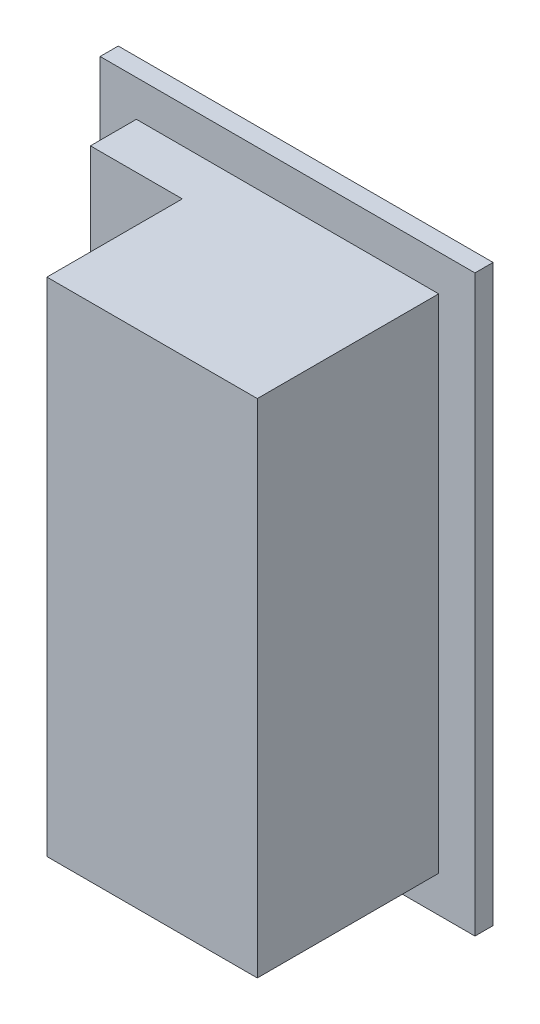
ISO-10303-21;
HEADER;
FILE_DESCRIPTION(('STEP AP214'),'2;1');
FILE_NAME('part.step','',(''),(''),'','','');
FILE_SCHEMA(('AUTOMOTIVE_DESIGN { 1 0 10303 214 1 1 1 1 }'));
ENDSEC;
DATA;
#1=APPLICATION_CONTEXT('core data for automotive mechanical design processes');
#2=APPLICATION_PROTOCOL_DEFINITION('international standard','automotive_design',2000,#1);
#3=PRODUCT_CONTEXT('',#1,'mechanical');
#4=PRODUCT('Part','Part','',(#3));
#5=PRODUCT_RELATED_PRODUCT_CATEGORY('part','',(#4));
#6=PRODUCT_DEFINITION_FORMATION('','',#4);
#7=PRODUCT_DEFINITION_CONTEXT('part definition',#1,'design');
#8=PRODUCT_DEFINITION('design','',#6,#7);
#9=PRODUCT_DEFINITION_SHAPE('','',#8);
#10=(LENGTH_UNIT() NAMED_UNIT(*) SI_UNIT(.MILLI.,.METRE.));
#11=(NAMED_UNIT(*) PLANE_ANGLE_UNIT() SI_UNIT($,.RADIAN.));
#12=(NAMED_UNIT(*) SI_UNIT($,.STERADIAN.) SOLID_ANGLE_UNIT());
#13=UNCERTAINTY_MEASURE_WITH_UNIT(LENGTH_MEASURE(1.E-05),#10,'distance_accuracy_value','');
#14=(GEOMETRIC_REPRESENTATION_CONTEXT(3) GLOBAL_UNCERTAINTY_ASSIGNED_CONTEXT((#13)) GLOBAL_UNIT_ASSIGNED_CONTEXT((#10,
#11,#12)) REPRESENTATION_CONTEXT('',''));
#15=CARTESIAN_POINT('',(0.,0.,0.));
#16=DIRECTION('',(0.,0.,1.));
#17=DIRECTION('',(1.,0.,0.));
#18=AXIS2_PLACEMENT_3D('',#15,#16,#17);
#19=CARTESIAN_POINT('',(0.,0.,1.5));
#20=DIRECTION('',(0.,0.,1.));
#21=DIRECTION('',(1.,0.,0.));
#22=AXIS2_PLACEMENT_3D('',#19,#20,#21);
#23=PLANE('',#22);
#24=DIRECTION('',(1.,0.,0.));
#25=VECTOR('',#24,1.);
#26=CARTESIAN_POINT('',(0.,0.,1.5));
#27=LINE('',#26,#25);
#28=CARTESIAN_POINT('',(-1.,0.,1.5));
#29=VERTEX_POINT('',#28);
#30=CARTESIAN_POINT('',(24.,0.,1.5));
#31=VERTEX_POINT('',#30);
#32=EDGE_CURVE('E256',#29,#31,#27,.T.);
#33=ORIENTED_EDGE('',*,*,#32,.F.);
#34=DIRECTION('',(0.,-1.,0.));
#35=VECTOR('',#34,1.);
#36=CARTESIAN_POINT('',(-1.,41.5,1.5));
#37=LINE('',#36,#35);
#38=CARTESIAN_POINT('',(-1.,41.5,1.5));
#39=VERTEX_POINT('',#38);
#40=EDGE_CURVE('E50',#39,#29,#37,.T.);
#41=ORIENTED_EDGE('',*,*,#40,.F.);
#42=DIRECTION('',(1.,0.,0.));
#43=VECTOR('',#42,1.);
#44=CARTESIAN_POINT('',(0.,41.5,1.5));
#45=LINE('',#44,#43);
#46=CARTESIAN_POINT('',(24.,41.5,1.5));
#47=VERTEX_POINT('',#46);
#48=EDGE_CURVE('E259',#39,#47,#45,.T.);
#49=ORIENTED_EDGE('',*,*,#48,.T.);
#50=DIRECTION('',(0.,1.,0.));
#51=VECTOR('',#50,1.);
#52=CARTESIAN_POINT('',(24.,0.,1.5));
#53=LINE('',#52,#51);
#54=EDGE_CURVE('E253',#31,#47,#53,.T.);
#55=ORIENTED_EDGE('',*,*,#54,.F.);
#56=EDGE_LOOP('',(#33,#41,#49,#55));
#57=FACE_BOUND('',#56,.T.);
#58=DIRECTION('',(1.,0.,0.));
#59=VECTOR('',#58,1.);
#60=CARTESIAN_POINT('',(0.,-3.,1.5));
#61=LINE('',#60,#59);
#62=CARTESIAN_POINT('',(-4.,-3.,1.5));
#63=VERTEX_POINT('',#62);
#64=CARTESIAN_POINT('',(27.,-3.,1.5));
#65=VERTEX_POINT('',#64);
#66=EDGE_CURVE('E261',#63,#65,#61,.T.);
#67=ORIENTED_EDGE('',*,*,#66,.T.);
#68=DIRECTION('',(0.,1.,0.));
#69=VECTOR('',#68,1.);
#70=CARTESIAN_POINT('',(27.,0.,1.5));
#71=LINE('',#70,#69);
#72=CARTESIAN_POINT('',(27.,44.5,1.5));
#73=VERTEX_POINT('',#72);
#74=EDGE_CURVE('E264',#65,#73,#71,.T.);
#75=ORIENTED_EDGE('',*,*,#74,.T.);
#76=DIRECTION('',(1.,0.,0.));
#77=VECTOR('',#76,1.);
#78=CARTESIAN_POINT('',(0.,44.5,1.5));
#79=LINE('',#78,#77);
#80=CARTESIAN_POINT('',(-4.,44.5,1.5));
#81=VERTEX_POINT('',#80);
#82=EDGE_CURVE('E266',#81,#73,#79,.T.);
#83=ORIENTED_EDGE('',*,*,#82,.F.);
#84=DIRECTION('',(0.,1.,0.));
#85=VECTOR('',#84,1.);
#86=CARTESIAN_POINT('',(-4.,0.,1.5));
#87=LINE('',#86,#85);
#88=EDGE_CURVE('E269',#63,#81,#87,.T.);
#89=ORIENTED_EDGE('',*,*,#88,.F.);
#90=EDGE_LOOP('',(#67,#75,#83,#89));
#91=FACE_BOUND('',#90,.T.);
#92=ADVANCED_FACE('F35',(#57,#91),#23,.T.);
#93=CARTESIAN_POINT('',(6.6,0.,-40.521542094502));
#94=DIRECTION('',(1.,0.,0.));
#95=DIRECTION('',(0.,0.,-1.));
#96=AXIS2_PLACEMENT_3D('',#93,#94,#95);
#97=PLANE('',#96);
#98=DIRECTION('',(0.,1.,0.));
#99=VECTOR('',#98,1.);
#100=CARTESIAN_POINT('',(6.6,0.,5.3));
#101=LINE('',#100,#99);
#102=CARTESIAN_POINT('',(6.6,0.,5.3));
#103=VERTEX_POINT('',#102);
#104=CARTESIAN_POINT('',(6.6,0.999999999999998,5.3));
#105=VERTEX_POINT('',#104);
#106=EDGE_CURVE('E189',#103,#105,#101,.T.);
#107=ORIENTED_EDGE('',*,*,#106,.F.);
#108=DIRECTION('',(0.,0.,1.));
#109=VECTOR('',#108,1.);
#110=CARTESIAN_POINT('',(6.6,0.,-40.521542094502));
#111=LINE('',#110,#109);
#112=CARTESIAN_POINT('',(6.6,0.,16.5));
#113=VERTEX_POINT('',#112);
#114=EDGE_CURVE('E208',#103,#113,#111,.T.);
#115=ORIENTED_EDGE('',*,*,#114,.T.);
#116=DIRECTION('',(0.,1.,0.));
#117=VECTOR('',#116,1.);
#118=CARTESIAN_POINT('',(6.6,0.,16.5));
#119=LINE('',#118,#117);
#120=CARTESIAN_POINT('',(6.6,41.5,16.5));
#121=VERTEX_POINT('',#120);
#122=EDGE_CURVE('E201',#113,#121,#119,.T.);
#123=ORIENTED_EDGE('',*,*,#122,.T.);
#124=DIRECTION('',(0.,0.,1.));
#125=VECTOR('',#124,1.);
#126=CARTESIAN_POINT('',(6.6,41.5,-40.521542094502));
#127=LINE('',#126,#125);
#128=CARTESIAN_POINT('',(6.6,41.5,5.29999999999999));
#129=VERTEX_POINT('',#128);
#130=EDGE_CURVE('E209',#129,#121,#127,.T.);
#131=ORIENTED_EDGE('',*,*,#130,.F.);
#132=DIRECTION('',(0.,1.,0.));
#133=VECTOR('',#132,1.);
#134=CARTESIAN_POINT('',(6.6,41.5,5.3));
#135=LINE('',#134,#133);
#136=CARTESIAN_POINT('',(6.6,40.5,5.3));
#137=VERTEX_POINT('',#136);
#138=EDGE_CURVE('E58',#137,#129,#135,.T.);
#139=ORIENTED_EDGE('',*,*,#138,.F.);
#140=DIRECTION('',(0.,0.,-1.));
#141=VECTOR('',#140,1.);
#142=CARTESIAN_POINT('',(6.6,40.5,16.5));
#143=LINE('',#142,#141);
#144=CARTESIAN_POINT('',(6.6,40.5,15.5));
#145=VERTEX_POINT('',#144);
#146=EDGE_CURVE('E180',#145,#137,#143,.T.);
#147=ORIENTED_EDGE('',*,*,#146,.F.);
#148=DIRECTION('',(0.,1.,0.));
#149=VECTOR('',#148,1.);
#150=CARTESIAN_POINT('',(6.6,0.,15.5));
#151=LINE('',#150,#149);
#152=CARTESIAN_POINT('',(6.6,0.999999999999997,15.5));
#153=VERTEX_POINT('',#152);
#154=EDGE_CURVE('E11',#153,#145,#151,.T.);
#155=ORIENTED_EDGE('',*,*,#154,.F.);
#156=DIRECTION('',(0.,0.,1.));
#157=VECTOR('',#156,1.);
#158=CARTESIAN_POINT('',(6.6,0.999999999999998,16.5));
#159=LINE('',#158,#157);
#160=EDGE_CURVE('E213',#105,#153,#159,.T.);
#161=ORIENTED_EDGE('',*,*,#160,.F.);
#162=EDGE_LOOP('',(#107,#115,#123,#131,#139,#147,#155,#161));
#163=FACE_BOUND('',#162,.T.);
#164=ADVANCED_FACE('F310',(#163),#97,.F.);
#165=CARTESIAN_POINT('',(23.,0.,16.5));
#166=DIRECTION('',(1.,0.,0.));
#167=DIRECTION('',(0.,1.,0.));
#168=AXIS2_PLACEMENT_3D('',#165,#166,#167);
#169=PLANE('',#168);
#170=DIRECTION('',(0.,1.,0.));
#171=VECTOR('',#170,1.);
#172=CARTESIAN_POINT('',(23.,0.,15.5));
#173=LINE('',#172,#171);
#174=CARTESIAN_POINT('',(23.,1.,15.5));
#175=VERTEX_POINT('',#174);
#176=CARTESIAN_POINT('',(23.,40.5,15.5));
#177=VERTEX_POINT('',#176);
#178=EDGE_CURVE('E217',#175,#177,#173,.T.);
#179=ORIENTED_EDGE('',*,*,#178,.T.);
#180=DIRECTION('',(0.,0.,-1.));
#181=VECTOR('',#180,1.);
#182=CARTESIAN_POINT('',(23.,40.5,16.5));
#183=LINE('',#182,#181);
#184=CARTESIAN_POINT('',(23.,40.5,0.));
#185=VERTEX_POINT('',#184);
#186=EDGE_CURVE('E231',#177,#185,#183,.T.);
#187=ORIENTED_EDGE('',*,*,#186,.T.);
#188=DIRECTION('',(0.,-1.,0.));
#189=VECTOR('',#188,1.);
#190=CARTESIAN_POINT('',(23.,0.,0.));
#191=LINE('',#190,#189);
#192=CARTESIAN_POINT('',(23.,1.,0.));
#193=VERTEX_POINT('',#192);
#194=EDGE_CURVE('E222',#185,#193,#191,.T.);
#195=ORIENTED_EDGE('',*,*,#194,.T.);
#196=DIRECTION('',(0.,0.,-1.));
#197=VECTOR('',#196,1.);
#198=CARTESIAN_POINT('',(23.,1.,16.5));
#199=LINE('',#198,#197);
#200=EDGE_CURVE('E250',#175,#193,#199,.T.);
#201=ORIENTED_EDGE('',*,*,#200,.F.);
#202=EDGE_LOOP('',(#179,#187,#195,#201));
#203=FACE_BOUND('',#202,.T.);
#204=ADVANCED_FACE('F316',(#203),#169,.F.);
#205=CARTESIAN_POINT('',(0.,0.999999999999997,16.5));
#206=DIRECTION('',(0.,-1.,0.));
#207=DIRECTION('',(1.,0.,0.));
#208=AXIS2_PLACEMENT_3D('',#205,#206,#207);
#209=PLANE('',#208);
#210=DIRECTION('',(0.,0.,-1.));
#211=VECTOR('',#210,1.);
#212=CARTESIAN_POINT('',(0.,0.999999999999999,16.5));
#213=LINE('',#212,#211);
#214=CARTESIAN_POINT('',(0.,0.999999999999997,4.3));
#215=VERTEX_POINT('',#214);
#216=CARTESIAN_POINT('',(0.,0.999999999999999,0.));
#217=VERTEX_POINT('',#216);
#218=EDGE_CURVE('E248',#215,#217,#213,.T.);
#219=ORIENTED_EDGE('',*,*,#218,.F.);
#220=DIRECTION('',(-1.,0.,0.));
#221=VECTOR('',#220,1.);
#222=CARTESIAN_POINT('',(0.,0.999999999999997,4.3));
#223=LINE('',#222,#221);
#224=CARTESIAN_POINT('',(6.6,0.999999999999997,4.3));
#225=VERTEX_POINT('',#224);
#226=EDGE_CURVE('E166',#225,#215,#223,.T.);
#227=ORIENTED_EDGE('',*,*,#226,.F.);
#228=DIRECTION('',(0.,0.,-1.));
#229=VECTOR('',#228,1.);
#230=CARTESIAN_POINT('',(6.6,0.999999999999997,16.5));
#231=LINE('',#230,#229);
#232=EDGE_CURVE('E162',#105,#225,#231,.T.);
#233=ORIENTED_EDGE('',*,*,#232,.F.);
#234=ORIENTED_EDGE('',*,*,#160,.T.);
#235=DIRECTION('',(1.,0.,0.));
#236=VECTOR('',#235,1.);
#237=CARTESIAN_POINT('',(0.,0.999999999999997,15.5));
#238=LINE('',#237,#236);
#239=EDGE_CURVE('E215',#153,#175,#238,.T.);
#240=ORIENTED_EDGE('',*,*,#239,.T.);
#241=ORIENTED_EDGE('',*,*,#200,.T.);
#242=DIRECTION('',(-1.,0.,0.));
#243=VECTOR('',#242,1.);
#244=CARTESIAN_POINT('',(0.,0.999999999999997,0.));
#245=LINE('',#244,#243);
#246=EDGE_CURVE('E234',#193,#217,#245,.T.);
#247=ORIENTED_EDGE('',*,*,#246,.T.);
#248=EDGE_LOOP('',(#219,#227,#233,#234,#240,#241,#247));
#249=FACE_BOUND('',#248,.T.);
#250=ADVANCED_FACE('F339',(#249),#209,.F.);
#251=CARTESIAN_POINT('',(0.,40.5,16.5));
#252=DIRECTION('',(0.,1.,0.));
#253=DIRECTION('',(0.,0.,1.));
#254=AXIS2_PLACEMENT_3D('',#251,#252,#253);
#255=PLANE('',#254);
#256=DIRECTION('',(-1.,0.,0.));
#257=VECTOR('',#256,1.);
#258=CARTESIAN_POINT('',(0.,40.5,4.3));
#259=LINE('',#258,#257);
#260=CARTESIAN_POINT('',(6.6,40.5,4.3));
#261=VERTEX_POINT('',#260);
#262=CARTESIAN_POINT('',(0.,40.5,4.3));
#263=VERTEX_POINT('',#262);
#264=EDGE_CURVE('E170',#261,#263,#259,.T.);
#265=ORIENTED_EDGE('',*,*,#264,.T.);
#266=DIRECTION('',(0.,0.,-1.));
#267=VECTOR('',#266,1.);
#268=CARTESIAN_POINT('',(0.,40.5,16.5));
#269=LINE('',#268,#267);
#270=CARTESIAN_POINT('',(0.,40.5,0.));
#271=VERTEX_POINT('',#270);
#272=EDGE_CURVE('E240',#263,#271,#269,.T.);
#273=ORIENTED_EDGE('',*,*,#272,.T.);
#274=DIRECTION('',(1.,0.,0.));
#275=VECTOR('',#274,1.);
#276=CARTESIAN_POINT('',(0.,40.5,0.));
#277=LINE('',#276,#275);
#278=EDGE_CURVE('E226',#271,#185,#277,.T.);
#279=ORIENTED_EDGE('',*,*,#278,.T.);
#280=ORIENTED_EDGE('',*,*,#186,.F.);
#281=DIRECTION('',(-1.,0.,0.));
#282=VECTOR('',#281,1.);
#283=CARTESIAN_POINT('',(0.,40.5,15.5));
#284=LINE('',#283,#282);
#285=EDGE_CURVE('E220',#177,#145,#284,.T.);
#286=ORIENTED_EDGE('',*,*,#285,.T.);
#287=ORIENTED_EDGE('',*,*,#146,.T.);
#288=DIRECTION('',(0.,0.,-1.));
#289=VECTOR('',#288,1.);
#290=CARTESIAN_POINT('',(6.6,40.5,16.5));
#291=LINE('',#290,#289);
#292=EDGE_CURVE('E160',#137,#261,#291,.T.);
#293=ORIENTED_EDGE('',*,*,#292,.T.);
#294=EDGE_LOOP('',(#265,#273,#279,#280,#286,#287,#293));
#295=FACE_BOUND('',#294,.T.);
#296=ADVANCED_FACE('F178',(#295),#255,.F.);
#297=CARTESIAN_POINT('',(0.,0.,1.5));
#298=DIRECTION('',(-1.,0.,0.));
#299=DIRECTION('',(0.,0.,1.));
#300=AXIS2_PLACEMENT_3D('',#297,#298,#299);
#301=PLANE('',#300);
#302=ORIENTED_EDGE('',*,*,#218,.T.);
#303=DIRECTION('',(0.,1.,0.));
#304=VECTOR('',#303,1.);
#305=CARTESIAN_POINT('',(0.,0.,0.));
#306=LINE('',#305,#304);
#307=EDGE_CURVE('E252',#217,#271,#306,.T.);
#308=ORIENTED_EDGE('',*,*,#307,.T.);
#309=ORIENTED_EDGE('',*,*,#272,.F.);
#310=DIRECTION('',(0.,1.,0.));
#311=VECTOR('',#310,1.);
#312=CARTESIAN_POINT('',(0.,-7.49705831449921,4.3));
#313=LINE('',#312,#311);
#314=EDGE_CURVE('E173',#215,#263,#313,.T.);
#315=ORIENTED_EDGE('',*,*,#314,.F.);
#316=EDGE_LOOP('',(#302,#308,#309,#315));
#317=FACE_BOUND('',#316,.T.);
#318=ADVANCED_FACE('F37',(#317),#301,.F.);
#319=CARTESIAN_POINT('',(0.,-3.,1.5));
#320=DIRECTION('',(0.,1.,0.));
#321=DIRECTION('',(0.,0.,1.));
#322=AXIS2_PLACEMENT_3D('',#319,#320,#321);
#323=PLANE('',#322);
#324=DIRECTION('',(1.,0.,0.));
#325=VECTOR('',#324,1.);
#326=CARTESIAN_POINT('',(0.,-3.,0.));
#327=LINE('',#326,#325);
#328=CARTESIAN_POINT('',(-4.,-3.,0.));
#329=VERTEX_POINT('',#328);
#330=CARTESIAN_POINT('',(27.,-3.,0.));
#331=VERTEX_POINT('',#330);
#332=EDGE_CURVE('E274',#329,#331,#327,.T.);
#333=ORIENTED_EDGE('',*,*,#332,.T.);
#334=DIRECTION('',(0.,0.,-1.));
#335=VECTOR('',#334,1.);
#336=CARTESIAN_POINT('',(27.,-3.,1.5));
#337=LINE('',#336,#335);
#338=EDGE_CURVE('E43',#65,#331,#337,.T.);
#339=ORIENTED_EDGE('',*,*,#338,.F.);
#340=ORIENTED_EDGE('',*,*,#66,.F.);
#341=DIRECTION('',(0.,0.,-1.));
#342=VECTOR('',#341,1.);
#343=CARTESIAN_POINT('',(-4.,-3.,1.5));
#344=LINE('',#343,#342);
#345=EDGE_CURVE('E272',#63,#329,#344,.T.);
#346=ORIENTED_EDGE('',*,*,#345,.T.);
#347=EDGE_LOOP('',(#333,#339,#340,#346));
#348=FACE_BOUND('',#347,.T.);
#349=ADVANCED_FACE('F297',(#348),#323,.F.);
#350=CARTESIAN_POINT('',(27.,0.,1.5));
#351=DIRECTION('',(-1.,0.,0.));
#352=DIRECTION('',(0.,0.,1.));
#353=AXIS2_PLACEMENT_3D('',#350,#351,#352);
#354=PLANE('',#353);
#355=DIRECTION('',(0.,1.,0.));
#356=VECTOR('',#355,1.);
#357=CARTESIAN_POINT('',(27.,0.,0.));
#358=LINE('',#357,#356);
#359=CARTESIAN_POINT('',(27.,44.5,0.));
#360=VERTEX_POINT('',#359);
#361=EDGE_CURVE('E277',#331,#360,#358,.T.);
#362=ORIENTED_EDGE('',*,*,#361,.T.);
#363=DIRECTION('',(0.,0.,-1.));
#364=VECTOR('',#363,1.);
#365=CARTESIAN_POINT('',(27.,44.5,1.5));
#366=LINE('',#365,#364);
#367=EDGE_CURVE('E288',#73,#360,#366,.T.);
#368=ORIENTED_EDGE('',*,*,#367,.F.);
#369=ORIENTED_EDGE('',*,*,#74,.F.);
#370=ORIENTED_EDGE('',*,*,#338,.T.);
#371=EDGE_LOOP('',(#362,#368,#369,#370));
#372=FACE_BOUND('',#371,.T.);
#373=ADVANCED_FACE('F292',(#372),#354,.F.);
#374=CARTESIAN_POINT('',(0.,44.5,1.5));
#375=DIRECTION('',(0.,1.,0.));
#376=DIRECTION('',(0.,0.,1.));
#377=AXIS2_PLACEMENT_3D('',#374,#375,#376);
#378=PLANE('',#377);
#379=DIRECTION('',(1.,0.,0.));
#380=VECTOR('',#379,1.);
#381=CARTESIAN_POINT('',(0.,44.5,0.));
#382=LINE('',#381,#380);
#383=CARTESIAN_POINT('',(-4.,44.5,0.));
#384=VERTEX_POINT('',#383);
#385=EDGE_CURVE('E280',#384,#360,#382,.T.);
#386=ORIENTED_EDGE('',*,*,#385,.F.);
#387=DIRECTION('',(0.,0.,-1.));
#388=VECTOR('',#387,1.);
#389=CARTESIAN_POINT('',(-4.,44.5,1.5));
#390=LINE('',#389,#388);
#391=EDGE_CURVE('E286',#81,#384,#390,.T.);
#392=ORIENTED_EDGE('',*,*,#391,.F.);
#393=ORIENTED_EDGE('',*,*,#82,.T.);
#394=ORIENTED_EDGE('',*,*,#367,.T.);
#395=EDGE_LOOP('',(#386,#392,#393,#394));
#396=FACE_BOUND('',#395,.T.);
#397=ADVANCED_FACE('F307',(#396),#378,.T.);
#398=CARTESIAN_POINT('',(-4.,0.,1.5));
#399=DIRECTION('',(-1.,0.,0.));
#400=DIRECTION('',(0.,0.,1.));
#401=AXIS2_PLACEMENT_3D('',#398,#399,#400);
#402=PLANE('',#401);
#403=DIRECTION('',(0.,1.,0.));
#404=VECTOR('',#403,1.);
#405=CARTESIAN_POINT('',(-4.,0.,0.));
#406=LINE('',#405,#404);
#407=EDGE_CURVE('E257',#329,#384,#406,.T.);
#408=ORIENTED_EDGE('',*,*,#407,.F.);
#409=ORIENTED_EDGE('',*,*,#345,.F.);
#410=ORIENTED_EDGE('',*,*,#88,.T.);
#411=ORIENTED_EDGE('',*,*,#391,.T.);
#412=EDGE_LOOP('',(#408,#409,#410,#411));
#413=FACE_BOUND('',#412,.T.);
#414=ADVANCED_FACE('F302',(#413),#402,.T.);
#415=CARTESIAN_POINT('',(0.,0.,0.));
#416=DIRECTION('',(0.,0.,1.));
#417=DIRECTION('',(1.,0.,0.));
#418=AXIS2_PLACEMENT_3D('',#415,#416,#417);
#419=PLANE('',#418);
#420=ORIENTED_EDGE('',*,*,#307,.F.);
#421=ORIENTED_EDGE('',*,*,#246,.F.);
#422=ORIENTED_EDGE('',*,*,#194,.F.);
#423=ORIENTED_EDGE('',*,*,#278,.F.);
#424=EDGE_LOOP('',(#420,#421,#422,#423));
#425=FACE_BOUND('',#424,.T.);
#426=ORIENTED_EDGE('',*,*,#332,.F.);
#427=ORIENTED_EDGE('',*,*,#407,.T.);
#428=ORIENTED_EDGE('',*,*,#385,.T.);
#429=ORIENTED_EDGE('',*,*,#361,.F.);
#430=EDGE_LOOP('',(#426,#427,#428,#429));
#431=FACE_BOUND('',#430,.T.);
#432=ADVANCED_FACE('F300',(#425,#431),#419,.F.);
#433=CARTESIAN_POINT('',(0.,0.,16.5));
#434=DIRECTION('',(0.,1.,0.));
#435=DIRECTION('',(0.,0.,1.));
#436=AXIS2_PLACEMENT_3D('',#433,#434,#435);
#437=PLANE('',#436);
#438=DIRECTION('',(1.,0.,0.));
#439=VECTOR('',#438,1.);
#440=CARTESIAN_POINT('',(0.,0.,16.5));
#441=LINE('',#440,#439);
#442=CARTESIAN_POINT('',(24.,0.,16.5));
#443=VERTEX_POINT('',#442);
#444=EDGE_CURVE('E223',#113,#443,#441,.T.);
#445=ORIENTED_EDGE('',*,*,#444,.F.);
#446=ORIENTED_EDGE('',*,*,#114,.F.);
#447=DIRECTION('',(1.,0.,0.));
#448=VECTOR('',#447,1.);
#449=CARTESIAN_POINT('',(-4.92937654087771,0.,5.3));
#450=LINE('',#449,#448);
#451=CARTESIAN_POINT('',(-0.999999999999999,0.,5.3));
#452=VERTEX_POINT('',#451);
#453=EDGE_CURVE('E188',#452,#103,#450,.T.);
#454=ORIENTED_EDGE('',*,*,#453,.F.);
#455=DIRECTION('',(0.,0.,1.));
#456=VECTOR('',#455,1.);
#457=CARTESIAN_POINT('',(-1.,0.,1.49999999999999));
#458=LINE('',#457,#456);
#459=EDGE_CURVE('E192',#29,#452,#458,.T.);
#460=ORIENTED_EDGE('',*,*,#459,.F.);
#461=ORIENTED_EDGE('',*,*,#32,.T.);
#462=DIRECTION('',(0.,0.,-1.));
#463=VECTOR('',#462,1.);
#464=CARTESIAN_POINT('',(24.,0.,16.5));
#465=LINE('',#464,#463);
#466=EDGE_CURVE('E245',#443,#31,#465,.T.);
#467=ORIENTED_EDGE('',*,*,#466,.F.);
#468=EDGE_LOOP('',(#445,#446,#454,#460,#461,#467));
#469=FACE_BOUND('',#468,.T.);
#470=ADVANCED_FACE('F324',(#469),#437,.F.);
#471=CARTESIAN_POINT('',(24.,0.,16.5));
#472=DIRECTION('',(-1.,0.,0.));
#473=DIRECTION('',(0.,0.,1.));
#474=AXIS2_PLACEMENT_3D('',#471,#472,#473);
#475=PLANE('',#474);
#476=ORIENTED_EDGE('',*,*,#54,.T.);
#477=DIRECTION('',(0.,0.,-1.));
#478=VECTOR('',#477,1.);
#479=CARTESIAN_POINT('',(24.,41.5,16.5));
#480=LINE('',#479,#478);
#481=CARTESIAN_POINT('',(24.,41.5,16.5));
#482=VERTEX_POINT('',#481);
#483=EDGE_CURVE('E242',#482,#47,#480,.T.);
#484=ORIENTED_EDGE('',*,*,#483,.F.);
#485=DIRECTION('',(0.,1.,0.));
#486=VECTOR('',#485,1.);
#487=CARTESIAN_POINT('',(24.,0.,16.5));
#488=LINE('',#487,#486);
#489=EDGE_CURVE('E225',#443,#482,#488,.T.);
#490=ORIENTED_EDGE('',*,*,#489,.F.);
#491=ORIENTED_EDGE('',*,*,#466,.T.);
#492=EDGE_LOOP('',(#476,#484,#490,#491));
#493=FACE_BOUND('',#492,.T.);
#494=ADVANCED_FACE('F385',(#493),#475,.F.);
#495=CARTESIAN_POINT('',(0.,41.5,16.5));
#496=DIRECTION('',(0.,1.,0.));
#497=DIRECTION('',(0.,0.,1.));
#498=AXIS2_PLACEMENT_3D('',#495,#496,#497);
#499=PLANE('',#498);
#500=ORIENTED_EDGE('',*,*,#48,.F.);
#501=DIRECTION('',(0.,0.,-1.));
#502=VECTOR('',#501,1.);
#503=CARTESIAN_POINT('',(-1.,41.5,1.5));
#504=LINE('',#503,#502);
#505=CARTESIAN_POINT('',(-1.,41.5,5.3));
#506=VERTEX_POINT('',#505);
#507=EDGE_CURVE('E203',#506,#39,#504,.T.);
#508=ORIENTED_EDGE('',*,*,#507,.F.);
#509=DIRECTION('',(1.,0.,0.));
#510=VECTOR('',#509,1.);
#511=CARTESIAN_POINT('',(-4.92937654087771,41.5,5.3));
#512=LINE('',#511,#510);
#513=EDGE_CURVE('E197',#506,#129,#512,.T.);
#514=ORIENTED_EDGE('',*,*,#513,.T.);
#515=ORIENTED_EDGE('',*,*,#130,.T.);
#516=DIRECTION('',(1.,0.,0.));
#517=VECTOR('',#516,1.);
#518=CARTESIAN_POINT('',(0.,41.5,16.5));
#519=LINE('',#518,#517);
#520=EDGE_CURVE('E229',#121,#482,#519,.T.);
#521=ORIENTED_EDGE('',*,*,#520,.T.);
#522=ORIENTED_EDGE('',*,*,#483,.T.);
#523=EDGE_LOOP('',(#500,#508,#514,#515,#521,#522));
#524=FACE_BOUND('',#523,.T.);
#525=ADVANCED_FACE('F360',(#524),#499,.T.);
#526=CARTESIAN_POINT('',(0.,0.,16.5));
#527=DIRECTION('',(0.,0.,1.));
#528=DIRECTION('',(1.,0.,0.));
#529=AXIS2_PLACEMENT_3D('',#526,#527,#528);
#530=PLANE('',#529);
#531=ORIENTED_EDGE('',*,*,#122,.F.);
#532=ORIENTED_EDGE('',*,*,#444,.T.);
#533=ORIENTED_EDGE('',*,*,#489,.T.);
#534=ORIENTED_EDGE('',*,*,#520,.F.);
#535=EDGE_LOOP('',(#531,#532,#533,#534));
#536=FACE_BOUND('',#535,.T.);
#537=ADVANCED_FACE('F379',(#536),#530,.T.);
#538=CARTESIAN_POINT('',(0.,0.,15.5));
#539=DIRECTION('',(0.,0.,1.));
#540=DIRECTION('',(1.,0.,0.));
#541=AXIS2_PLACEMENT_3D('',#538,#539,#540);
#542=PLANE('',#541);
#543=ORIENTED_EDGE('',*,*,#239,.F.);
#544=ORIENTED_EDGE('',*,*,#154,.T.);
#545=ORIENTED_EDGE('',*,*,#285,.F.);
#546=ORIENTED_EDGE('',*,*,#178,.F.);
#547=EDGE_LOOP('',(#543,#544,#545,#546));
#548=FACE_BOUND('',#547,.T.);
#549=ADVANCED_FACE('F352',(#548),#542,.F.);
#550=CARTESIAN_POINT('',(-4.92937654087771,41.5,5.3));
#551=DIRECTION('',(0.,0.,-1.));
#552=DIRECTION('',(0.,1.,0.));
#553=AXIS2_PLACEMENT_3D('',#550,#551,#552);
#554=PLANE('',#553);
#555=DIRECTION('',(0.,1.,0.));
#556=VECTOR('',#555,1.);
#557=CARTESIAN_POINT('',(-0.999999999999999,41.5,5.3));
#558=LINE('',#557,#556);
#559=EDGE_CURVE('E198',#452,#506,#558,.T.);
#560=ORIENTED_EDGE('',*,*,#559,.F.);
#561=ORIENTED_EDGE('',*,*,#453,.T.);
#562=ORIENTED_EDGE('',*,*,#106,.T.);
#563=DIRECTION('',(0.,1.,0.));
#564=VECTOR('',#563,1.);
#565=CARTESIAN_POINT('',(6.6,-7.49705831449921,5.3));
#566=LINE('',#565,#564);
#567=EDGE_CURVE('E181',#105,#137,#566,.T.);
#568=ORIENTED_EDGE('',*,*,#567,.T.);
#569=ORIENTED_EDGE('',*,*,#138,.T.);
#570=ORIENTED_EDGE('',*,*,#513,.F.);
#571=EDGE_LOOP('',(#560,#561,#562,#568,#569,#570));
#572=FACE_BOUND('',#571,.T.);
#573=ADVANCED_FACE('F362',(#572),#554,.F.);
#574=CARTESIAN_POINT('',(-0.999999999999998,-7.49705831449921,16.5));
#575=DIRECTION('',(-1.,0.,0.));
#576=DIRECTION('',(0.,0.,1.));
#577=AXIS2_PLACEMENT_3D('',#574,#575,#576);
#578=PLANE('',#577);
#579=ORIENTED_EDGE('',*,*,#507,.T.);
#580=ORIENTED_EDGE('',*,*,#40,.T.);
#581=ORIENTED_EDGE('',*,*,#459,.T.);
#582=ORIENTED_EDGE('',*,*,#559,.T.);
#583=EDGE_LOOP('',(#579,#580,#581,#582));
#584=FACE_BOUND('',#583,.T.);
#585=ADVANCED_FACE('F367',(#584),#578,.T.);
#586=CARTESIAN_POINT('',(6.6,-7.49705831449921,16.5));
#587=DIRECTION('',(1.,0.,0.));
#588=DIRECTION('',(0.,0.,-1.));
#589=AXIS2_PLACEMENT_3D('',#586,#587,#588);
#590=PLANE('',#589);
#591=ORIENTED_EDGE('',*,*,#567,.F.);
#592=ORIENTED_EDGE('',*,*,#232,.T.);
#593=DIRECTION('',(0.,1.,0.));
#594=VECTOR('',#593,1.);
#595=CARTESIAN_POINT('',(6.6,-7.49705831449921,4.3));
#596=LINE('',#595,#594);
#597=EDGE_CURVE('E156',#225,#261,#596,.T.);
#598=ORIENTED_EDGE('',*,*,#597,.T.);
#599=ORIENTED_EDGE('',*,*,#292,.F.);
#600=EDGE_LOOP('',(#591,#592,#598,#599));
#601=FACE_BOUND('',#600,.T.);
#602=ADVANCED_FACE('F158',(#601),#590,.T.);
#603=CARTESIAN_POINT('',(0.,-7.49705831449921,4.3));
#604=DIRECTION('',(0.,0.,-1.));
#605=DIRECTION('',(-1.,0.,0.));
#606=AXIS2_PLACEMENT_3D('',#603,#604,#605);
#607=PLANE('',#606);
#608=ORIENTED_EDGE('',*,*,#597,.F.);
#609=ORIENTED_EDGE('',*,*,#226,.T.);
#610=ORIENTED_EDGE('',*,*,#314,.T.);
#611=ORIENTED_EDGE('',*,*,#264,.F.);
#612=EDGE_LOOP('',(#608,#609,#610,#611));
#613=FACE_BOUND('',#612,.T.);
#614=ADVANCED_FACE('F171',(#613),#607,.T.);
#615=CLOSED_SHELL('',(#92,#164,#204,#250,#296,#318,#349,#373,#397,#414,#432,#470,#494,#525,#537,
#549,#573,#585,#602,#614));
#616=MANIFOLD_SOLID_BREP('B2',#615);
#617=ADVANCED_BREP_SHAPE_REPRESENTATION('',(#18,#616),#14);
#618=SHAPE_DEFINITION_REPRESENTATION(#9,#617);
ENDSEC;
END-ISO-10303-21;
